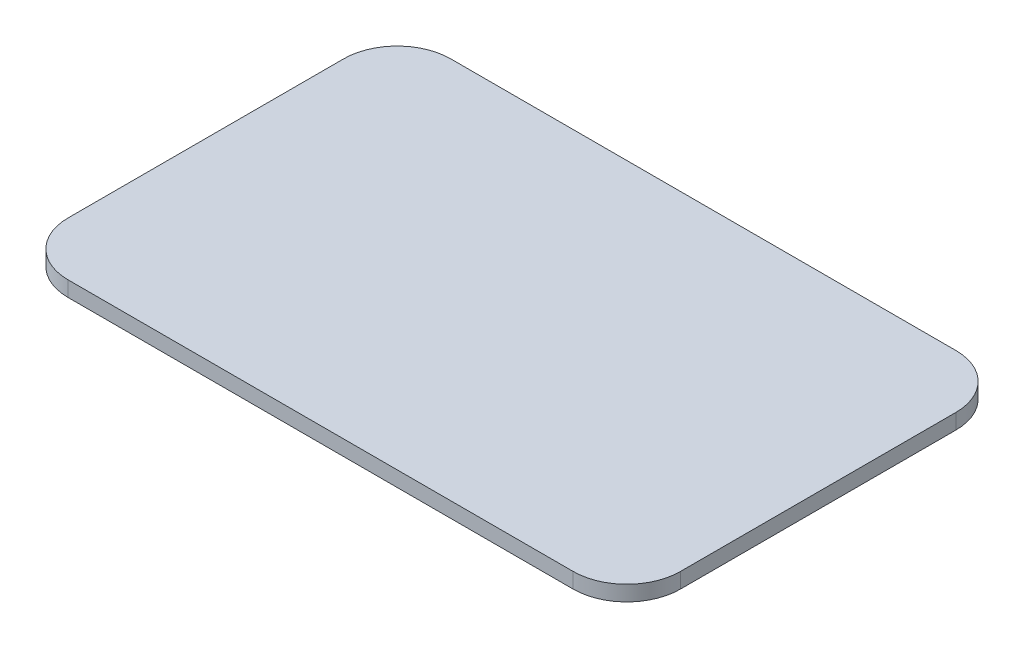
ISO-10303-21;
HEADER;
FILE_DESCRIPTION(('STEP AP214'),'2;1');
FILE_NAME('part.step','',(''),(''),'','','');
FILE_SCHEMA(('AUTOMOTIVE_DESIGN { 1 0 10303 214 1 1 1 1 }'));
ENDSEC;
DATA;
#1=APPLICATION_CONTEXT('core data for automotive mechanical design processes');
#2=APPLICATION_PROTOCOL_DEFINITION('international standard','automotive_design',2000,#1);
#3=PRODUCT_CONTEXT('',#1,'mechanical');
#4=PRODUCT('Part','Part','',(#3));
#5=PRODUCT_RELATED_PRODUCT_CATEGORY('part','',(#4));
#6=PRODUCT_DEFINITION_FORMATION('','',#4);
#7=PRODUCT_DEFINITION_CONTEXT('part definition',#1,'design');
#8=PRODUCT_DEFINITION('design','',#6,#7);
#9=PRODUCT_DEFINITION_SHAPE('','',#8);
#10=(LENGTH_UNIT() NAMED_UNIT(*) SI_UNIT(.MILLI.,.METRE.));
#11=(NAMED_UNIT(*) PLANE_ANGLE_UNIT() SI_UNIT($,.RADIAN.));
#12=(NAMED_UNIT(*) SI_UNIT($,.STERADIAN.) SOLID_ANGLE_UNIT());
#13=UNCERTAINTY_MEASURE_WITH_UNIT(LENGTH_MEASURE(1.E-05),#10,'distance_accuracy_value','');
#14=(GEOMETRIC_REPRESENTATION_CONTEXT(3) GLOBAL_UNCERTAINTY_ASSIGNED_CONTEXT((#13)) GLOBAL_UNIT_ASSIGNED_CONTEXT((#10,
#11,#12)) REPRESENTATION_CONTEXT('',''));
#15=CARTESIAN_POINT('',(0.,0.,0.));
#16=DIRECTION('',(0.,0.,1.));
#17=DIRECTION('',(1.,0.,0.));
#18=AXIS2_PLACEMENT_3D('',#15,#16,#17);
#19=CARTESIAN_POINT('',(40.,2.,-25.));
#20=DIRECTION('',(-1.,0.,0.));
#21=DIRECTION('',(0.,0.,1.));
#22=AXIS2_PLACEMENT_3D('',#19,#20,#21);
#23=PLANE('',#22);
#24=DIRECTION('',(0.,0.,-1.));
#25=VECTOR('',#24,1.);
#26=CARTESIAN_POINT('',(40.,0.,-25.));
#27=LINE('',#26,#25);
#28=CARTESIAN_POINT('',(40.,0.,18.));
#29=VERTEX_POINT('',#28);
#30=CARTESIAN_POINT('',(40.,0.,-18.));
#31=VERTEX_POINT('',#30);
#32=EDGE_CURVE('E182',#29,#31,#27,.T.);
#33=ORIENTED_EDGE('',*,*,#32,.T.);
#34=DIRECTION('',(0.,-1.,0.));
#35=VECTOR('',#34,1.);
#36=CARTESIAN_POINT('',(40.,2.,-18.));
#37=LINE('',#36,#35);
#38=CARTESIAN_POINT('',(40.,2.,-18.));
#39=VERTEX_POINT('',#38);
#40=EDGE_CURVE('E11',#31,#39,#37,.F.);
#41=ORIENTED_EDGE('',*,*,#40,.T.);
#42=DIRECTION('',(0.,0.,-1.));
#43=VECTOR('',#42,1.);
#44=CARTESIAN_POINT('',(40.,2.,-25.));
#45=LINE('',#44,#43);
#46=CARTESIAN_POINT('',(40.,2.,18.));
#47=VERTEX_POINT('',#46);
#48=EDGE_CURVE('E135',#47,#39,#45,.T.);
#49=ORIENTED_EDGE('',*,*,#48,.F.);
#50=DIRECTION('',(0.,-1.,0.));
#51=VECTOR('',#50,1.);
#52=CARTESIAN_POINT('',(40.,2.,18.));
#53=LINE('',#52,#51);
#54=EDGE_CURVE('E48',#47,#29,#53,.T.);
#55=ORIENTED_EDGE('',*,*,#54,.T.);
#56=EDGE_LOOP('',(#33,#41,#49,#55));
#57=FACE_BOUND('',#56,.T.);
#58=ADVANCED_FACE('F39',(#57),#23,.F.);
#59=CARTESIAN_POINT('',(-40.,2.,-25.));
#60=DIRECTION('',(0.,0.,1.));
#61=DIRECTION('',(1.,0.,0.));
#62=AXIS2_PLACEMENT_3D('',#59,#60,#61);
#63=PLANE('',#62);
#64=DIRECTION('',(-1.,0.,0.));
#65=VECTOR('',#64,1.);
#66=CARTESIAN_POINT('',(-40.,0.,-25.));
#67=LINE('',#66,#65);
#68=CARTESIAN_POINT('',(33.,0.,-25.));
#69=VERTEX_POINT('',#68);
#70=CARTESIAN_POINT('',(-33.,0.,-25.));
#71=VERTEX_POINT('',#70);
#72=EDGE_CURVE('E142',#69,#71,#67,.T.);
#73=ORIENTED_EDGE('',*,*,#72,.T.);
#74=DIRECTION('',(0.,-1.,0.));
#75=VECTOR('',#74,1.);
#76=CARTESIAN_POINT('',(-33.,2.,-25.));
#77=LINE('',#76,#75);
#78=CARTESIAN_POINT('',(-33.,2.,-25.));
#79=VERTEX_POINT('',#78);
#80=EDGE_CURVE('E55',#71,#79,#77,.F.);
#81=ORIENTED_EDGE('',*,*,#80,.T.);
#82=DIRECTION('',(-1.,0.,0.));
#83=VECTOR('',#82,1.);
#84=CARTESIAN_POINT('',(-40.,2.,-25.));
#85=LINE('',#84,#83);
#86=CARTESIAN_POINT('',(33.,2.,-25.));
#87=VERTEX_POINT('',#86);
#88=EDGE_CURVE('E140',#87,#79,#85,.T.);
#89=ORIENTED_EDGE('',*,*,#88,.F.);
#90=DIRECTION('',(0.,-1.,0.));
#91=VECTOR('',#90,1.);
#92=CARTESIAN_POINT('',(33.,2.,-25.));
#93=LINE('',#92,#91);
#94=EDGE_CURVE('E171',#87,#69,#93,.T.);
#95=ORIENTED_EDGE('',*,*,#94,.T.);
#96=EDGE_LOOP('',(#73,#81,#89,#95));
#97=FACE_BOUND('',#96,.T.);
#98=ADVANCED_FACE('F207',(#97),#63,.F.);
#99=CARTESIAN_POINT('',(-40.,2.,-25.));
#100=DIRECTION('',(1.,0.,0.));
#101=DIRECTION('',(0.,0.,-1.));
#102=AXIS2_PLACEMENT_3D('',#99,#100,#101);
#103=PLANE('',#102);
#104=DIRECTION('',(0.,0.,1.));
#105=VECTOR('',#104,1.);
#106=CARTESIAN_POINT('',(-40.,0.,-25.));
#107=LINE('',#106,#105);
#108=CARTESIAN_POINT('',(-40.,0.,-18.));
#109=VERTEX_POINT('',#108);
#110=CARTESIAN_POINT('',(-40.,0.,18.));
#111=VERTEX_POINT('',#110);
#112=EDGE_CURVE('E136',#109,#111,#107,.T.);
#113=ORIENTED_EDGE('',*,*,#112,.T.);
#114=DIRECTION('',(0.,-1.,0.));
#115=VECTOR('',#114,1.);
#116=CARTESIAN_POINT('',(-40.,2.,18.));
#117=LINE('',#116,#115);
#118=CARTESIAN_POINT('',(-40.,2.,18.));
#119=VERTEX_POINT('',#118);
#120=EDGE_CURVE('E111',#111,#119,#117,.F.);
#121=ORIENTED_EDGE('',*,*,#120,.T.);
#122=DIRECTION('',(0.,0.,1.));
#123=VECTOR('',#122,1.);
#124=CARTESIAN_POINT('',(-40.,2.,-25.));
#125=LINE('',#124,#123);
#126=CARTESIAN_POINT('',(-40.,2.,-18.));
#127=VERTEX_POINT('',#126);
#128=EDGE_CURVE('E193',#127,#119,#125,.T.);
#129=ORIENTED_EDGE('',*,*,#128,.F.);
#130=DIRECTION('',(0.,-1.,0.));
#131=VECTOR('',#130,1.);
#132=CARTESIAN_POINT('',(-40.,2.,-18.));
#133=LINE('',#132,#131);
#134=EDGE_CURVE('E117',#127,#109,#133,.T.);
#135=ORIENTED_EDGE('',*,*,#134,.T.);
#136=EDGE_LOOP('',(#113,#121,#129,#135));
#137=FACE_BOUND('',#136,.T.);
#138=ADVANCED_FACE('F206',(#137),#103,.F.);
#139=CARTESIAN_POINT('',(-40.,2.,25.));
#140=DIRECTION('',(0.,0.,-1.));
#141=DIRECTION('',(-1.,0.,0.));
#142=AXIS2_PLACEMENT_3D('',#139,#140,#141);
#143=PLANE('',#142);
#144=DIRECTION('',(1.,0.,0.));
#145=VECTOR('',#144,1.);
#146=CARTESIAN_POINT('',(-40.,2.,25.));
#147=LINE('',#146,#145);
#148=CARTESIAN_POINT('',(-33.,2.,25.));
#149=VERTEX_POINT('',#148);
#150=CARTESIAN_POINT('',(33.,2.,25.));
#151=VERTEX_POINT('',#150);
#152=EDGE_CURVE('E127',#149,#151,#147,.T.);
#153=ORIENTED_EDGE('',*,*,#152,.F.);
#154=DIRECTION('',(0.,-1.,0.));
#155=VECTOR('',#154,1.);
#156=CARTESIAN_POINT('',(-33.,2.,25.));
#157=LINE('',#156,#155);
#158=CARTESIAN_POINT('',(-33.,0.,25.));
#159=VERTEX_POINT('',#158);
#160=EDGE_CURVE('E110',#149,#159,#157,.T.);
#161=ORIENTED_EDGE('',*,*,#160,.T.);
#162=DIRECTION('',(1.,0.,0.));
#163=VECTOR('',#162,1.);
#164=CARTESIAN_POINT('',(-40.,0.,25.));
#165=LINE('',#164,#163);
#166=CARTESIAN_POINT('',(33.,0.,25.));
#167=VERTEX_POINT('',#166);
#168=EDGE_CURVE('E124',#159,#167,#165,.T.);
#169=ORIENTED_EDGE('',*,*,#168,.T.);
#170=DIRECTION('',(0.,-1.,0.));
#171=VECTOR('',#170,1.);
#172=CARTESIAN_POINT('',(33.,2.,25.));
#173=LINE('',#172,#171);
#174=EDGE_CURVE('E130',#167,#151,#173,.F.);
#175=ORIENTED_EDGE('',*,*,#174,.T.);
#176=EDGE_LOOP('',(#153,#161,#169,#175));
#177=FACE_BOUND('',#176,.T.);
#178=ADVANCED_FACE('F123',(#177),#143,.F.);
#179=CARTESIAN_POINT('',(0.,2.,0.));
#180=DIRECTION('',(0.,1.,0.));
#181=DIRECTION('',(0.,0.,1.));
#182=AXIS2_PLACEMENT_3D('',#179,#180,#181);
#183=PLANE('',#182);
#184=ORIENTED_EDGE('',*,*,#128,.T.);
#185=CARTESIAN_POINT('',(-33.,2.,18.));
#186=DIRECTION('',(0.,1.,0.));
#187=DIRECTION('',(0.,0.,1.));
#188=AXIS2_PLACEMENT_3D('',#185,#186,#187);
#189=CIRCLE('',#188,7.);
#190=EDGE_CURVE('E168',#119,#149,#189,.T.);
#191=ORIENTED_EDGE('',*,*,#190,.T.);
#192=ORIENTED_EDGE('',*,*,#152,.T.);
#193=CARTESIAN_POINT('',(33.,2.,18.));
#194=DIRECTION('',(0.,1.,0.));
#195=DIRECTION('',(0.,0.,1.));
#196=AXIS2_PLACEMENT_3D('',#193,#194,#195);
#197=CIRCLE('',#196,7.);
#198=EDGE_CURVE('E160',#151,#47,#197,.T.);
#199=ORIENTED_EDGE('',*,*,#198,.T.);
#200=ORIENTED_EDGE('',*,*,#48,.T.);
#201=CARTESIAN_POINT('',(33.,2.,-18.));
#202=DIRECTION('',(0.,1.,0.));
#203=DIRECTION('',(0.,0.,1.));
#204=AXIS2_PLACEMENT_3D('',#201,#202,#203);
#205=CIRCLE('',#204,7.);
#206=EDGE_CURVE('E62',#39,#87,#205,.T.);
#207=ORIENTED_EDGE('',*,*,#206,.T.);
#208=ORIENTED_EDGE('',*,*,#88,.T.);
#209=CARTESIAN_POINT('',(-33.,2.,-18.));
#210=DIRECTION('',(0.,1.,0.));
#211=DIRECTION('',(0.,0.,1.));
#212=AXIS2_PLACEMENT_3D('',#209,#210,#211);
#213=CIRCLE('',#212,7.);
#214=EDGE_CURVE('E165',#79,#127,#213,.T.);
#215=ORIENTED_EDGE('',*,*,#214,.T.);
#216=EDGE_LOOP('',(#184,#191,#192,#199,#200,#207,#208,#215));
#217=FACE_BOUND('',#216,.T.);
#218=ADVANCED_FACE('F199',(#217),#183,.T.);
#219=CARTESIAN_POINT('',(0.,0.,0.));
#220=DIRECTION('',(0.,1.,0.));
#221=DIRECTION('',(0.,0.,1.));
#222=AXIS2_PLACEMENT_3D('',#219,#220,#221);
#223=PLANE('',#222);
#224=ORIENTED_EDGE('',*,*,#168,.F.);
#225=CARTESIAN_POINT('',(-33.,0.,18.));
#226=DIRECTION('',(0.,1.,0.));
#227=DIRECTION('',(0.,0.,1.));
#228=AXIS2_PLACEMENT_3D('',#225,#226,#227);
#229=CIRCLE('',#228,7.);
#230=EDGE_CURVE('E106',#159,#111,#229,.F.);
#231=ORIENTED_EDGE('',*,*,#230,.T.);
#232=ORIENTED_EDGE('',*,*,#112,.F.);
#233=CARTESIAN_POINT('',(-33.,0.,-18.));
#234=DIRECTION('',(0.,1.,0.));
#235=DIRECTION('',(0.,0.,1.));
#236=AXIS2_PLACEMENT_3D('',#233,#234,#235);
#237=CIRCLE('',#236,7.);
#238=EDGE_CURVE('E118',#109,#71,#237,.F.);
#239=ORIENTED_EDGE('',*,*,#238,.T.);
#240=ORIENTED_EDGE('',*,*,#72,.F.);
#241=CARTESIAN_POINT('',(33.,0.,-18.));
#242=DIRECTION('',(0.,1.,0.));
#243=DIRECTION('',(0.,0.,1.));
#244=AXIS2_PLACEMENT_3D('',#241,#242,#243);
#245=CIRCLE('',#244,7.);
#246=EDGE_CURVE('E150',#69,#31,#245,.F.);
#247=ORIENTED_EDGE('',*,*,#246,.T.);
#248=ORIENTED_EDGE('',*,*,#32,.F.);
#249=CARTESIAN_POINT('',(33.,0.,18.));
#250=DIRECTION('',(0.,1.,0.));
#251=DIRECTION('',(0.,0.,1.));
#252=AXIS2_PLACEMENT_3D('',#249,#250,#251);
#253=CIRCLE('',#252,7.);
#254=EDGE_CURVE('E129',#29,#167,#253,.F.);
#255=ORIENTED_EDGE('',*,*,#254,.T.);
#256=EDGE_LOOP('',(#224,#231,#232,#239,#240,#247,#248,#255));
#257=FACE_BOUND('',#256,.T.);
#258=ADVANCED_FACE('F132',(#257),#223,.F.);
#259=CARTESIAN_POINT('',(-33.,2.,18.));
#260=DIRECTION('',(0.,-1.,0.));
#261=DIRECTION('',(0.,0.,-1.));
#262=AXIS2_PLACEMENT_3D('',#259,#260,#261);
#263=CYLINDRICAL_SURFACE('',#262,7.);
#264=ORIENTED_EDGE('',*,*,#190,.F.);
#265=ORIENTED_EDGE('',*,*,#120,.F.);
#266=ORIENTED_EDGE('',*,*,#230,.F.);
#267=ORIENTED_EDGE('',*,*,#160,.F.);
#268=EDGE_LOOP('',(#264,#265,#266,#267));
#269=FACE_BOUND('',#268,.T.);
#270=ADVANCED_FACE('F109',(#269),#263,.T.);
#271=CARTESIAN_POINT('',(-33.,2.,-18.));
#272=DIRECTION('',(0.,-1.,0.));
#273=DIRECTION('',(0.,0.,-1.));
#274=AXIS2_PLACEMENT_3D('',#271,#272,#273);
#275=CYLINDRICAL_SURFACE('',#274,7.);
#276=ORIENTED_EDGE('',*,*,#214,.F.);
#277=ORIENTED_EDGE('',*,*,#80,.F.);
#278=ORIENTED_EDGE('',*,*,#238,.F.);
#279=ORIENTED_EDGE('',*,*,#134,.F.);
#280=EDGE_LOOP('',(#276,#277,#278,#279));
#281=FACE_BOUND('',#280,.T.);
#282=ADVANCED_FACE('F204',(#281),#275,.T.);
#283=CARTESIAN_POINT('',(33.,2.,-18.));
#284=DIRECTION('',(0.,-1.,0.));
#285=DIRECTION('',(0.,0.,-1.));
#286=AXIS2_PLACEMENT_3D('',#283,#284,#285);
#287=CYLINDRICAL_SURFACE('',#286,7.);
#288=ORIENTED_EDGE('',*,*,#206,.F.);
#289=ORIENTED_EDGE('',*,*,#40,.F.);
#290=ORIENTED_EDGE('',*,*,#246,.F.);
#291=ORIENTED_EDGE('',*,*,#94,.F.);
#292=EDGE_LOOP('',(#288,#289,#290,#291));
#293=FACE_BOUND('',#292,.T.);
#294=ADVANCED_FACE('F209',(#293),#287,.T.);
#295=CARTESIAN_POINT('',(33.,2.,18.));
#296=DIRECTION('',(0.,-1.,0.));
#297=DIRECTION('',(0.,0.,-1.));
#298=AXIS2_PLACEMENT_3D('',#295,#296,#297);
#299=CYLINDRICAL_SURFACE('',#298,7.);
#300=ORIENTED_EDGE('',*,*,#198,.F.);
#301=ORIENTED_EDGE('',*,*,#174,.F.);
#302=ORIENTED_EDGE('',*,*,#254,.F.);
#303=ORIENTED_EDGE('',*,*,#54,.F.);
#304=EDGE_LOOP('',(#300,#301,#302,#303));
#305=FACE_BOUND('',#304,.T.);
#306=ADVANCED_FACE('F41',(#305),#299,.T.);
#307=CLOSED_SHELL('',(#58,#98,#138,#178,#218,#258,#270,#282,#294,#306));
#308=MANIFOLD_SOLID_BREP('B2',#307);
#309=ADVANCED_BREP_SHAPE_REPRESENTATION('',(#18,#308),#14);
#310=SHAPE_DEFINITION_REPRESENTATION(#9,#309);
ENDSEC;
END-ISO-10303-21;
